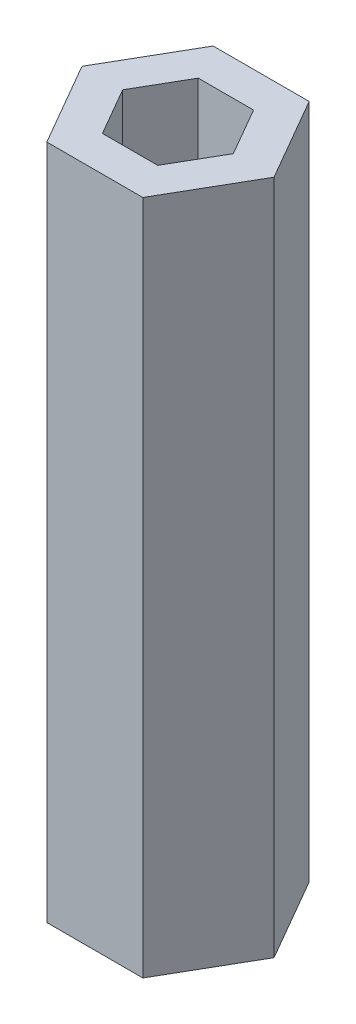
ISO-10303-21;
HEADER;
FILE_DESCRIPTION(('STEP AP214'),'2;1');
FILE_NAME('part.step','',(''),(''),'','','');
FILE_SCHEMA(('AUTOMOTIVE_DESIGN { 1 0 10303 214 1 1 1 1 }'));
ENDSEC;
DATA;
#1=APPLICATION_CONTEXT('core data for automotive mechanical design processes');
#2=APPLICATION_PROTOCOL_DEFINITION('international standard','automotive_design',2000,#1);
#3=PRODUCT_CONTEXT('',#1,'mechanical');
#4=PRODUCT('Part','Part','',(#3));
#5=PRODUCT_RELATED_PRODUCT_CATEGORY('part','',(#4));
#6=PRODUCT_DEFINITION_FORMATION('','',#4);
#7=PRODUCT_DEFINITION_CONTEXT('part definition',#1,'design');
#8=PRODUCT_DEFINITION('design','',#6,#7);
#9=PRODUCT_DEFINITION_SHAPE('','',#8);
#10=(LENGTH_UNIT() NAMED_UNIT(*) SI_UNIT(.MILLI.,.METRE.));
#11=(NAMED_UNIT(*) PLANE_ANGLE_UNIT() SI_UNIT($,.RADIAN.));
#12=(NAMED_UNIT(*) SI_UNIT($,.STERADIAN.) SOLID_ANGLE_UNIT());
#13=UNCERTAINTY_MEASURE_WITH_UNIT(LENGTH_MEASURE(1.E-05),#10,'distance_accuracy_value','');
#14=(GEOMETRIC_REPRESENTATION_CONTEXT(3) GLOBAL_UNCERTAINTY_ASSIGNED_CONTEXT((#13)) GLOBAL_UNIT_ASSIGNED_CONTEXT((#10,
#11,#12)) REPRESENTATION_CONTEXT('',''));
#15=CARTESIAN_POINT('',(0.,0.,0.));
#16=DIRECTION('',(0.,0.,1.));
#17=DIRECTION('',(1.,0.,0.));
#18=AXIS2_PLACEMENT_3D('',#15,#16,#17);
#19=CARTESIAN_POINT('',(0.,50.8,0.));
#20=DIRECTION('',(0.,1.,0.));
#21=DIRECTION('',(0.,0.,1.));
#22=AXIS2_PLACEMENT_3D('',#19,#20,#21);
#23=PLANE('',#22);
#24=DIRECTION('',(-0.5,0.,-0.866025403784438));
#25=VECTOR('',#24,1.);
#26=CARTESIAN_POINT('',(7.21687836487032,50.8,0.));
#27=LINE('',#26,#25);
#28=CARTESIAN_POINT('',(7.21687836487032,50.8,0.));
#29=VERTEX_POINT('',#28);
#30=CARTESIAN_POINT('',(3.60843918243516,50.8,-6.25));
#31=VERTEX_POINT('',#30);
#32=EDGE_CURVE('E204',#29,#31,#27,.T.);
#33=ORIENTED_EDGE('',*,*,#32,.T.);
#34=DIRECTION('',(-1.,0.,0.));
#35=VECTOR('',#34,1.);
#36=CARTESIAN_POINT('',(3.60843918243516,50.8,-6.25));
#37=LINE('',#36,#35);
#38=CARTESIAN_POINT('',(-3.60843918243516,50.8,-6.25));
#39=VERTEX_POINT('',#38);
#40=EDGE_CURVE('E208',#31,#39,#37,.T.);
#41=ORIENTED_EDGE('',*,*,#40,.T.);
#42=DIRECTION('',(-0.5,0.,0.866025403784439));
#43=VECTOR('',#42,1.);
#44=CARTESIAN_POINT('',(-3.60843918243516,50.8,-6.25));
#45=LINE('',#44,#43);
#46=CARTESIAN_POINT('',(-7.21687836487032,50.8,0.));
#47=VERTEX_POINT('',#46);
#48=EDGE_CURVE('E212',#39,#47,#45,.T.);
#49=ORIENTED_EDGE('',*,*,#48,.T.);
#50=DIRECTION('',(0.5,0.,0.866025403784439));
#51=VECTOR('',#50,1.);
#52=CARTESIAN_POINT('',(-7.21687836487032,50.8,0.));
#53=LINE('',#52,#51);
#54=CARTESIAN_POINT('',(-3.60843918243516,50.8,6.25));
#55=VERTEX_POINT('',#54);
#56=EDGE_CURVE('E215',#47,#55,#53,.T.);
#57=ORIENTED_EDGE('',*,*,#56,.T.);
#58=DIRECTION('',(1.,0.,0.));
#59=VECTOR('',#58,1.);
#60=CARTESIAN_POINT('',(-3.60843918243516,50.8,6.25));
#61=LINE('',#60,#59);
#62=CARTESIAN_POINT('',(3.60843918243516,50.8,6.25));
#63=VERTEX_POINT('',#62);
#64=EDGE_CURVE('E218',#55,#63,#61,.T.);
#65=ORIENTED_EDGE('',*,*,#64,.T.);
#66=DIRECTION('',(0.5,0.,-0.866025403784439));
#67=VECTOR('',#66,1.);
#68=CARTESIAN_POINT('',(3.60843918243516,50.8,6.25));
#69=LINE('',#68,#67);
#70=EDGE_CURVE('E221',#63,#29,#69,.T.);
#71=ORIENTED_EDGE('',*,*,#70,.T.);
#72=EDGE_LOOP('',(#33,#41,#49,#57,#65,#71));
#73=FACE_BOUND('',#72,.T.);
#74=DIRECTION('',(-1.,0.,0.));
#75=VECTOR('',#74,1.);
#76=CARTESIAN_POINT('',(2.07846096908266,50.8,-3.60000000000001));
#77=LINE('',#76,#75);
#78=CARTESIAN_POINT('',(2.07846096908266,50.8,-3.60000000000001));
#79=VERTEX_POINT('',#78);
#80=CARTESIAN_POINT('',(-2.07846096908266,50.8,-3.60000000000001));
#81=VERTEX_POINT('',#80);
#82=EDGE_CURVE('E144',#79,#81,#77,.T.);
#83=ORIENTED_EDGE('',*,*,#82,.F.);
#84=DIRECTION('',(-0.500000000000001,0.,-0.866025403784438));
#85=VECTOR('',#84,1.);
#86=CARTESIAN_POINT('',(4.15692193816532,50.8,0.));
#87=LINE('',#86,#85);
#88=CARTESIAN_POINT('',(4.15692193816532,50.8,0.));
#89=VERTEX_POINT('',#88);
#90=EDGE_CURVE('E135',#89,#79,#87,.T.);
#91=ORIENTED_EDGE('',*,*,#90,.F.);
#92=DIRECTION('',(0.499999999999999,0.,-0.866025403784439));
#93=VECTOR('',#92,1.);
#94=CARTESIAN_POINT('',(2.07846096908266,50.8,3.60000000000001));
#95=LINE('',#94,#93);
#96=CARTESIAN_POINT('',(2.07846096908266,50.8,3.60000000000001));
#97=VERTEX_POINT('',#96);
#98=EDGE_CURVE('E170',#97,#89,#95,.T.);
#99=ORIENTED_EDGE('',*,*,#98,.F.);
#100=DIRECTION('',(1.,0.,0.));
#101=VECTOR('',#100,1.);
#102=CARTESIAN_POINT('',(-2.07846096908266,50.8,3.60000000000001));
#103=LINE('',#102,#101);
#104=CARTESIAN_POINT('',(-2.07846096908266,50.8,3.60000000000001));
#105=VERTEX_POINT('',#104);
#106=EDGE_CURVE('E167',#105,#97,#103,.T.);
#107=ORIENTED_EDGE('',*,*,#106,.F.);
#108=DIRECTION('',(0.5,0.,0.866025403784438));
#109=VECTOR('',#108,1.);
#110=CARTESIAN_POINT('',(-4.15692193816532,50.8,0.));
#111=LINE('',#110,#109);
#112=CARTESIAN_POINT('',(-4.15692193816532,50.8,0.));
#113=VERTEX_POINT('',#112);
#114=EDGE_CURVE('E162',#113,#105,#111,.T.);
#115=ORIENTED_EDGE('',*,*,#114,.F.);
#116=DIRECTION('',(-0.499999999999999,0.,0.866025403784439));
#117=VECTOR('',#116,1.);
#118=CARTESIAN_POINT('',(-2.07846096908266,50.8,-3.60000000000001));
#119=LINE('',#118,#117);
#120=EDGE_CURVE('E158',#81,#113,#119,.T.);
#121=ORIENTED_EDGE('',*,*,#120,.F.);
#122=EDGE_LOOP('',(#83,#91,#99,#107,#115,#121));
#123=FACE_BOUND('',#122,.T.);
#124=ADVANCED_FACE('F45',(#73,#123),#23,.T.);
#125=CARTESIAN_POINT('',(0.,0.,0.));
#126=DIRECTION('',(0.,1.,0.));
#127=DIRECTION('',(0.,0.,1.));
#128=AXIS2_PLACEMENT_3D('',#125,#126,#127);
#129=PLANE('',#128);
#130=DIRECTION('',(-0.5,0.,-0.866025403784438));
#131=VECTOR('',#130,1.);
#132=CARTESIAN_POINT('',(7.21687836487032,0.,0.));
#133=LINE('',#132,#131);
#134=CARTESIAN_POINT('',(7.21687836487032,0.,0.));
#135=VERTEX_POINT('',#134);
#136=CARTESIAN_POINT('',(3.60843918243516,0.,-6.25));
#137=VERTEX_POINT('',#136);
#138=EDGE_CURVE('E153',#135,#137,#133,.T.);
#139=ORIENTED_EDGE('',*,*,#138,.F.);
#140=DIRECTION('',(0.5,0.,-0.866025403784439));
#141=VECTOR('',#140,1.);
#142=CARTESIAN_POINT('',(3.60843918243516,0.,6.25));
#143=LINE('',#142,#141);
#144=CARTESIAN_POINT('',(3.60843918243516,0.,6.25));
#145=VERTEX_POINT('',#144);
#146=EDGE_CURVE('E209',#145,#135,#143,.T.);
#147=ORIENTED_EDGE('',*,*,#146,.F.);
#148=DIRECTION('',(1.,0.,0.));
#149=VECTOR('',#148,1.);
#150=CARTESIAN_POINT('',(-3.60843918243516,0.,6.25));
#151=LINE('',#150,#149);
#152=CARTESIAN_POINT('',(-3.60843918243516,0.,6.25));
#153=VERTEX_POINT('',#152);
#154=EDGE_CURVE('E237',#153,#145,#151,.T.);
#155=ORIENTED_EDGE('',*,*,#154,.F.);
#156=DIRECTION('',(0.5,0.,0.866025403784439));
#157=VECTOR('',#156,1.);
#158=CARTESIAN_POINT('',(-7.21687836487032,0.,0.));
#159=LINE('',#158,#157);
#160=CARTESIAN_POINT('',(-7.21687836487032,0.,0.));
#161=VERTEX_POINT('',#160);
#162=EDGE_CURVE('E234',#161,#153,#159,.T.);
#163=ORIENTED_EDGE('',*,*,#162,.F.);
#164=DIRECTION('',(-0.5,0.,0.866025403784439));
#165=VECTOR('',#164,1.);
#166=CARTESIAN_POINT('',(-3.60843918243516,0.,-6.25));
#167=LINE('',#166,#165);
#168=CARTESIAN_POINT('',(-3.60843918243516,0.,-6.25));
#169=VERTEX_POINT('',#168);
#170=EDGE_CURVE('E231',#169,#161,#167,.T.);
#171=ORIENTED_EDGE('',*,*,#170,.F.);
#172=DIRECTION('',(-1.,0.,0.));
#173=VECTOR('',#172,1.);
#174=CARTESIAN_POINT('',(3.60843918243516,0.,-6.25));
#175=LINE('',#174,#173);
#176=EDGE_CURVE('E228',#137,#169,#175,.T.);
#177=ORIENTED_EDGE('',*,*,#176,.F.);
#178=EDGE_LOOP('',(#139,#147,#155,#163,#171,#177));
#179=FACE_BOUND('',#178,.T.);
#180=DIRECTION('',(-0.500000000000001,0.,-0.866025403784438));
#181=VECTOR('',#180,1.);
#182=CARTESIAN_POINT('',(4.15692193816532,0.,0.));
#183=LINE('',#182,#181);
#184=CARTESIAN_POINT('',(4.15692193816532,0.,0.));
#185=VERTEX_POINT('',#184);
#186=CARTESIAN_POINT('',(2.07846096908266,0.,-3.60000000000001));
#187=VERTEX_POINT('',#186);
#188=EDGE_CURVE('E69',#185,#187,#183,.T.);
#189=ORIENTED_EDGE('',*,*,#188,.T.);
#190=DIRECTION('',(-1.,0.,0.));
#191=VECTOR('',#190,1.);
#192=CARTESIAN_POINT('',(2.07846096908266,0.,-3.60000000000001));
#193=LINE('',#192,#191);
#194=CARTESIAN_POINT('',(-2.07846096908266,0.,-3.60000000000001));
#195=VERTEX_POINT('',#194);
#196=EDGE_CURVE('E151',#187,#195,#193,.T.);
#197=ORIENTED_EDGE('',*,*,#196,.T.);
#198=DIRECTION('',(-0.499999999999999,0.,0.866025403784439));
#199=VECTOR('',#198,1.);
#200=CARTESIAN_POINT('',(-2.07846096908266,0.,-3.60000000000001));
#201=LINE('',#200,#199);
#202=CARTESIAN_POINT('',(-4.15692193816532,0.,0.));
#203=VERTEX_POINT('',#202);
#204=EDGE_CURVE('E177',#195,#203,#201,.T.);
#205=ORIENTED_EDGE('',*,*,#204,.T.);
#206=DIRECTION('',(0.5,0.,0.866025403784438));
#207=VECTOR('',#206,1.);
#208=CARTESIAN_POINT('',(-4.15692193816532,0.,0.));
#209=LINE('',#208,#207);
#210=CARTESIAN_POINT('',(-2.07846096908266,0.,3.60000000000001));
#211=VERTEX_POINT('',#210);
#212=EDGE_CURVE('E181',#203,#211,#209,.T.);
#213=ORIENTED_EDGE('',*,*,#212,.T.);
#214=DIRECTION('',(1.,0.,0.));
#215=VECTOR('',#214,1.);
#216=CARTESIAN_POINT('',(-2.07846096908266,0.,3.60000000000001));
#217=LINE('',#216,#215);
#218=CARTESIAN_POINT('',(2.07846096908266,0.,3.60000000000001));
#219=VERTEX_POINT('',#218);
#220=EDGE_CURVE('E185',#211,#219,#217,.T.);
#221=ORIENTED_EDGE('',*,*,#220,.T.);
#222=DIRECTION('',(0.499999999999999,0.,-0.866025403784439));
#223=VECTOR('',#222,1.);
#224=CARTESIAN_POINT('',(2.07846096908266,0.,3.60000000000001));
#225=LINE('',#224,#223);
#226=EDGE_CURVE('E145',#219,#185,#225,.T.);
#227=ORIENTED_EDGE('',*,*,#226,.T.);
#228=EDGE_LOOP('',(#189,#197,#205,#213,#221,#227));
#229=FACE_BOUND('',#228,.T.);
#230=ADVANCED_FACE('F268',(#179,#229),#129,.F.);
#231=CARTESIAN_POINT('',(7.21687836487032,50.8,0.));
#232=DIRECTION('',(-0.866025403784438,0.,0.5));
#233=DIRECTION('',(0.5,0.,0.866025403784439));
#234=AXIS2_PLACEMENT_3D('',#231,#232,#233);
#235=PLANE('',#234);
#236=ORIENTED_EDGE('',*,*,#138,.T.);
#237=DIRECTION('',(0.,-1.,0.));
#238=VECTOR('',#237,1.);
#239=CARTESIAN_POINT('',(3.60843918243516,50.8,-6.25));
#240=LINE('',#239,#238);
#241=EDGE_CURVE('E11',#31,#137,#240,.T.);
#242=ORIENTED_EDGE('',*,*,#241,.F.);
#243=ORIENTED_EDGE('',*,*,#32,.F.);
#244=DIRECTION('',(0.,-1.,0.));
#245=VECTOR('',#244,1.);
#246=CARTESIAN_POINT('',(7.21687836487032,50.8,0.));
#247=LINE('',#246,#245);
#248=EDGE_CURVE('E224',#29,#135,#247,.T.);
#249=ORIENTED_EDGE('',*,*,#248,.T.);
#250=EDGE_LOOP('',(#236,#242,#243,#249));
#251=FACE_BOUND('',#250,.T.);
#252=ADVANCED_FACE('F47',(#251),#235,.F.);
#253=CARTESIAN_POINT('',(3.60843918243516,50.8,-6.25));
#254=DIRECTION('',(0.,0.,1.));
#255=DIRECTION('',(1.,0.,0.));
#256=AXIS2_PLACEMENT_3D('',#253,#254,#255);
#257=PLANE('',#256);
#258=ORIENTED_EDGE('',*,*,#176,.T.);
#259=DIRECTION('',(0.,-1.,0.));
#260=VECTOR('',#259,1.);
#261=CARTESIAN_POINT('',(-3.60843918243516,50.8,-6.25));
#262=LINE('',#261,#260);
#263=EDGE_CURVE('E54',#39,#169,#262,.T.);
#264=ORIENTED_EDGE('',*,*,#263,.F.);
#265=ORIENTED_EDGE('',*,*,#40,.F.);
#266=ORIENTED_EDGE('',*,*,#241,.T.);
#267=EDGE_LOOP('',(#258,#264,#265,#266));
#268=FACE_BOUND('',#267,.T.);
#269=ADVANCED_FACE('F285',(#268),#257,.F.);
#270=CARTESIAN_POINT('',(-3.60843918243516,50.8,-6.25));
#271=DIRECTION('',(0.866025403784439,0.,0.5));
#272=DIRECTION('',(0.5,0.,-0.866025403784439));
#273=AXIS2_PLACEMENT_3D('',#270,#271,#272);
#274=PLANE('',#273);
#275=ORIENTED_EDGE('',*,*,#170,.T.);
#276=DIRECTION('',(0.,-1.,0.));
#277=VECTOR('',#276,1.);
#278=CARTESIAN_POINT('',(-7.21687836487032,50.8,0.));
#279=LINE('',#278,#277);
#280=EDGE_CURVE('E253',#47,#161,#279,.T.);
#281=ORIENTED_EDGE('',*,*,#280,.F.);
#282=ORIENTED_EDGE('',*,*,#48,.F.);
#283=ORIENTED_EDGE('',*,*,#263,.T.);
#284=EDGE_LOOP('',(#275,#281,#282,#283));
#285=FACE_BOUND('',#284,.T.);
#286=ADVANCED_FACE('F262',(#285),#274,.F.);
#287=CARTESIAN_POINT('',(-7.21687836487032,50.8,0.));
#288=DIRECTION('',(0.866025403784438,0.,-0.5));
#289=DIRECTION('',(-0.5,0.,-0.866025403784439));
#290=AXIS2_PLACEMENT_3D('',#287,#288,#289);
#291=PLANE('',#290);
#292=ORIENTED_EDGE('',*,*,#162,.T.);
#293=DIRECTION('',(0.,-1.,0.));
#294=VECTOR('',#293,1.);
#295=CARTESIAN_POINT('',(-3.60843918243516,50.8,6.25));
#296=LINE('',#295,#294);
#297=EDGE_CURVE('E249',#55,#153,#296,.T.);
#298=ORIENTED_EDGE('',*,*,#297,.F.);
#299=ORIENTED_EDGE('',*,*,#56,.F.);
#300=ORIENTED_EDGE('',*,*,#280,.T.);
#301=EDGE_LOOP('',(#292,#298,#299,#300));
#302=FACE_BOUND('',#301,.T.);
#303=ADVANCED_FACE('F274',(#302),#291,.F.);
#304=CARTESIAN_POINT('',(-3.60843918243516,50.8,6.25));
#305=DIRECTION('',(0.,0.,-1.));
#306=DIRECTION('',(-1.,0.,0.));
#307=AXIS2_PLACEMENT_3D('',#304,#305,#306);
#308=PLANE('',#307);
#309=ORIENTED_EDGE('',*,*,#154,.T.);
#310=DIRECTION('',(0.,-1.,0.));
#311=VECTOR('',#310,1.);
#312=CARTESIAN_POINT('',(3.60843918243516,50.8,6.25));
#313=LINE('',#312,#311);
#314=EDGE_CURVE('E245',#63,#145,#313,.T.);
#315=ORIENTED_EDGE('',*,*,#314,.F.);
#316=ORIENTED_EDGE('',*,*,#64,.F.);
#317=ORIENTED_EDGE('',*,*,#297,.T.);
#318=EDGE_LOOP('',(#309,#315,#316,#317));
#319=FACE_BOUND('',#318,.T.);
#320=ADVANCED_FACE('F278',(#319),#308,.F.);
#321=CARTESIAN_POINT('',(3.60843918243516,50.8,6.25));
#322=DIRECTION('',(-0.866025403784439,0.,-0.5));
#323=DIRECTION('',(-0.5,0.,0.866025403784439));
#324=AXIS2_PLACEMENT_3D('',#321,#322,#323);
#325=PLANE('',#324);
#326=ORIENTED_EDGE('',*,*,#146,.T.);
#327=ORIENTED_EDGE('',*,*,#248,.F.);
#328=ORIENTED_EDGE('',*,*,#70,.F.);
#329=ORIENTED_EDGE('',*,*,#314,.T.);
#330=EDGE_LOOP('',(#326,#327,#328,#329));
#331=FACE_BOUND('',#330,.T.);
#332=ADVANCED_FACE('F288',(#331),#325,.F.);
#333=CARTESIAN_POINT('',(4.15692193816532,50.8,0.));
#334=DIRECTION('',(-0.866025403784438,0.,0.500000000000001));
#335=DIRECTION('',(0.500000000000001,0.,0.866025403784438));
#336=AXIS2_PLACEMENT_3D('',#333,#334,#335);
#337=PLANE('',#336);
#338=ORIENTED_EDGE('',*,*,#188,.F.);
#339=DIRECTION('',(0.,-1.,0.));
#340=VECTOR('',#339,1.);
#341=CARTESIAN_POINT('',(4.15692193816532,50.8,0.));
#342=LINE('',#341,#340);
#343=EDGE_CURVE('E139',#89,#185,#342,.T.);
#344=ORIENTED_EDGE('',*,*,#343,.F.);
#345=ORIENTED_EDGE('',*,*,#90,.T.);
#346=DIRECTION('',(0.,-1.,0.));
#347=VECTOR('',#346,1.);
#348=CARTESIAN_POINT('',(2.07846096908266,50.8,-3.60000000000001));
#349=LINE('',#348,#347);
#350=EDGE_CURVE('E138',#79,#187,#349,.T.);
#351=ORIENTED_EDGE('',*,*,#350,.T.);
#352=EDGE_LOOP('',(#338,#344,#345,#351));
#353=FACE_BOUND('',#352,.T.);
#354=ADVANCED_FACE('F137',(#353),#337,.T.);
#355=CARTESIAN_POINT('',(2.07846096908266,50.8,-3.60000000000001));
#356=DIRECTION('',(0.,0.,1.));
#357=DIRECTION('',(1.,0.,0.));
#358=AXIS2_PLACEMENT_3D('',#355,#356,#357);
#359=PLANE('',#358);
#360=ORIENTED_EDGE('',*,*,#196,.F.);
#361=ORIENTED_EDGE('',*,*,#350,.F.);
#362=ORIENTED_EDGE('',*,*,#82,.T.);
#363=DIRECTION('',(0.,-1.,0.));
#364=VECTOR('',#363,1.);
#365=CARTESIAN_POINT('',(-2.07846096908266,50.8,-3.60000000000001));
#366=LINE('',#365,#364);
#367=EDGE_CURVE('E154',#81,#195,#366,.T.);
#368=ORIENTED_EDGE('',*,*,#367,.T.);
#369=EDGE_LOOP('',(#360,#361,#362,#368));
#370=FACE_BOUND('',#369,.T.);
#371=ADVANCED_FACE('F148',(#370),#359,.T.);
#372=CARTESIAN_POINT('',(-2.07846096908266,50.8,-3.60000000000001));
#373=DIRECTION('',(0.866025403784439,0.,0.499999999999999));
#374=DIRECTION('',(0.499999999999999,0.,-0.866025403784439));
#375=AXIS2_PLACEMENT_3D('',#372,#373,#374);
#376=PLANE('',#375);
#377=ORIENTED_EDGE('',*,*,#204,.F.);
#378=ORIENTED_EDGE('',*,*,#367,.F.);
#379=ORIENTED_EDGE('',*,*,#120,.T.);
#380=DIRECTION('',(0.,-1.,0.));
#381=VECTOR('',#380,1.);
#382=CARTESIAN_POINT('',(-4.15692193816532,50.8,0.));
#383=LINE('',#382,#381);
#384=EDGE_CURVE('E199',#113,#203,#383,.T.);
#385=ORIENTED_EDGE('',*,*,#384,.T.);
#386=EDGE_LOOP('',(#377,#378,#379,#385));
#387=FACE_BOUND('',#386,.T.);
#388=ADVANCED_FACE('F306',(#387),#376,.T.);
#389=CARTESIAN_POINT('',(-4.15692193816532,50.8,0.));
#390=DIRECTION('',(0.866025403784438,0.,-0.5));
#391=DIRECTION('',(-0.5,0.,-0.866025403784438));
#392=AXIS2_PLACEMENT_3D('',#389,#390,#391);
#393=PLANE('',#392);
#394=ORIENTED_EDGE('',*,*,#212,.F.);
#395=ORIENTED_EDGE('',*,*,#384,.F.);
#396=ORIENTED_EDGE('',*,*,#114,.T.);
#397=DIRECTION('',(0.,-1.,0.));
#398=VECTOR('',#397,1.);
#399=CARTESIAN_POINT('',(-2.07846096908266,50.8,3.60000000000001));
#400=LINE('',#399,#398);
#401=EDGE_CURVE('E196',#105,#211,#400,.T.);
#402=ORIENTED_EDGE('',*,*,#401,.T.);
#403=EDGE_LOOP('',(#394,#395,#396,#402));
#404=FACE_BOUND('',#403,.T.);
#405=ADVANCED_FACE('F309',(#404),#393,.T.);
#406=CARTESIAN_POINT('',(-2.07846096908266,50.8,3.60000000000001));
#407=DIRECTION('',(0.,0.,-1.));
#408=DIRECTION('',(-1.,0.,0.));
#409=AXIS2_PLACEMENT_3D('',#406,#407,#408);
#410=PLANE('',#409);
#411=ORIENTED_EDGE('',*,*,#220,.F.);
#412=ORIENTED_EDGE('',*,*,#401,.F.);
#413=ORIENTED_EDGE('',*,*,#106,.T.);
#414=DIRECTION('',(0.,-1.,0.));
#415=VECTOR('',#414,1.);
#416=CARTESIAN_POINT('',(2.07846096908266,50.8,3.60000000000001));
#417=LINE('',#416,#415);
#418=EDGE_CURVE('E61',#97,#219,#417,.T.);
#419=ORIENTED_EDGE('',*,*,#418,.T.);
#420=EDGE_LOOP('',(#411,#412,#413,#419));
#421=FACE_BOUND('',#420,.T.);
#422=ADVANCED_FACE('F313',(#421),#410,.T.);
#423=CARTESIAN_POINT('',(2.07846096908266,50.8,3.60000000000001));
#424=DIRECTION('',(-0.866025403784439,0.,-0.499999999999999));
#425=DIRECTION('',(-0.499999999999999,0.,0.866025403784439));
#426=AXIS2_PLACEMENT_3D('',#423,#424,#425);
#427=PLANE('',#426);
#428=ORIENTED_EDGE('',*,*,#226,.F.);
#429=ORIENTED_EDGE('',*,*,#418,.F.);
#430=ORIENTED_EDGE('',*,*,#98,.T.);
#431=ORIENTED_EDGE('',*,*,#343,.T.);
#432=EDGE_LOOP('',(#428,#429,#430,#431));
#433=FACE_BOUND('',#432,.T.);
#434=ADVANCED_FACE('F317',(#433),#427,.T.);
#435=CLOSED_SHELL('',(#124,#230,#252,#269,#286,#303,#320,#332,#354,#371,#388,#405,#422,#434));
#436=MANIFOLD_SOLID_BREP('B2',#435);
#437=ADVANCED_BREP_SHAPE_REPRESENTATION('',(#18,#436),#14);
#438=SHAPE_DEFINITION_REPRESENTATION(#9,#437);
ENDSEC;
END-ISO-10303-21;
